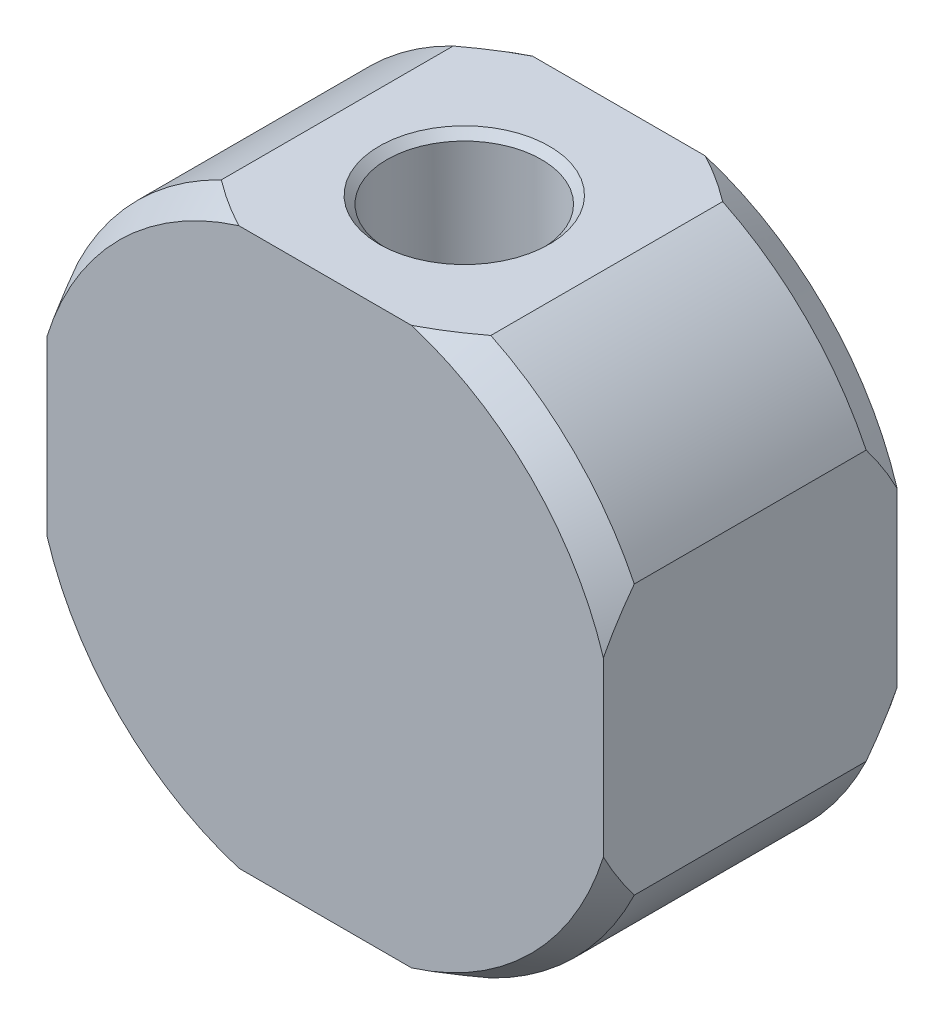
ISO-10303-21;
HEADER;
FILE_DESCRIPTION(('STEP AP214'),'2;1');
FILE_NAME('part.step','',(''),(''),'','','');
FILE_SCHEMA(('AUTOMOTIVE_DESIGN { 1 0 10303 214 1 1 1 1 }'));
ENDSEC;
DATA;
#1=APPLICATION_CONTEXT('core data for automotive mechanical design processes');
#2=APPLICATION_PROTOCOL_DEFINITION('international standard','automotive_design',2000,#1);
#3=PRODUCT_CONTEXT('',#1,'mechanical');
#4=PRODUCT('Part','Part','',(#3));
#5=PRODUCT_RELATED_PRODUCT_CATEGORY('part','',(#4));
#6=PRODUCT_DEFINITION_FORMATION('','',#4);
#7=PRODUCT_DEFINITION_CONTEXT('part definition',#1,'design');
#8=PRODUCT_DEFINITION('design','',#6,#7);
#9=PRODUCT_DEFINITION_SHAPE('','',#8);
#10=(LENGTH_UNIT() NAMED_UNIT(*) SI_UNIT(.MILLI.,.METRE.));
#11=(NAMED_UNIT(*) PLANE_ANGLE_UNIT() SI_UNIT($,.RADIAN.));
#12=(NAMED_UNIT(*) SI_UNIT($,.STERADIAN.) SOLID_ANGLE_UNIT());
#13=UNCERTAINTY_MEASURE_WITH_UNIT(LENGTH_MEASURE(1.E-05),#10,'distance_accuracy_value','');
#14=(GEOMETRIC_REPRESENTATION_CONTEXT(3) GLOBAL_UNCERTAINTY_ASSIGNED_CONTEXT((#13)) GLOBAL_UNIT_ASSIGNED_CONTEXT((#10,
#11,#12)) REPRESENTATION_CONTEXT('',''));
#15=CARTESIAN_POINT('',(0.,0.,0.));
#16=DIRECTION('',(0.,0.,1.));
#17=DIRECTION('',(1.,0.,0.));
#18=AXIS2_PLACEMENT_3D('',#15,#16,#17);
#19=CARTESIAN_POINT('',(0.,0.,8.5));
#20=DIRECTION('',(0.,0.,-1.));
#21=DIRECTION('',(-1.,0.,0.));
#22=AXIS2_PLACEMENT_3D('',#19,#20,#21);
#23=CYLINDRICAL_SURFACE('',#22,10.);
#24=CARTESIAN_POINT('',(0.,0.,1.));
#25=DIRECTION('',(0.,0.,1.));
#26=DIRECTION('',(1.,0.,0.));
#27=AXIS2_PLACEMENT_3D('',#24,#25,#26);
#28=CIRCLE('',#27,10.);
#29=CARTESIAN_POINT('',(-9.,-4.35889894377034,1.00000000017339));
#30=VERTEX_POINT('',#29);
#31=CARTESIAN_POINT('',(-4.35889894377034,-9.,1.00000000017339));
#32=VERTEX_POINT('',#31);
#33=EDGE_CURVE('E275',#30,#32,#28,.T.);
#34=ORIENTED_EDGE('',*,*,#33,.T.);
#35=DIRECTION('',(0.,0.,1.));
#36=VECTOR('',#35,1.);
#37=CARTESIAN_POINT('',(-4.358898944,-9.,4.75));
#38=LINE('',#37,#36);
#39=CARTESIAN_POINT('',(-4.35889894377034,-9.,8.49999999999995));
#40=VERTEX_POINT('',#39);
#41=EDGE_CURVE('E270',#32,#40,#38,.T.);
#42=ORIENTED_EDGE('',*,*,#41,.T.);
#43=CARTESIAN_POINT('',(0.,0.,8.49999999999995));
#44=DIRECTION('',(0.,0.,-1.));
#45=DIRECTION('',(-1.,0.,0.));
#46=AXIS2_PLACEMENT_3D('',#43,#44,#45);
#47=CIRCLE('',#46,10.);
#48=CARTESIAN_POINT('',(-9.,-4.35889894377034,8.49999999982658));
#49=VERTEX_POINT('',#48);
#50=EDGE_CURVE('E283',#40,#49,#47,.T.);
#51=ORIENTED_EDGE('',*,*,#50,.T.);
#52=DIRECTION('',(0.,0.,-1.));
#53=VECTOR('',#52,1.);
#54=CARTESIAN_POINT('',(-9.,-4.358898944,4.75));
#55=LINE('',#54,#53);
#56=EDGE_CURVE('E137',#49,#30,#55,.T.);
#57=ORIENTED_EDGE('',*,*,#56,.T.);
#58=EDGE_LOOP('',(#34,#42,#51,#57));
#59=FACE_BOUND('',#58,.T.);
#60=ADVANCED_FACE('F17',(#59),#23,.T.);
#61=CARTESIAN_POINT('',(0.,0.,8.5));
#62=DIRECTION('',(0.,0.,-1.));
#63=DIRECTION('',(-1.,0.,0.));
#64=AXIS2_PLACEMENT_3D('',#61,#62,#63);
#65=CYLINDRICAL_SURFACE('',#64,10.);
#66=CARTESIAN_POINT('',(0.,0.,1.));
#67=DIRECTION('',(0.,0.,1.));
#68=DIRECTION('',(1.,0.,0.));
#69=AXIS2_PLACEMENT_3D('',#66,#67,#68);
#70=CIRCLE('',#69,10.);
#71=CARTESIAN_POINT('',(4.35889894377034,-9.,1.00000000017339));
#72=VERTEX_POINT('',#71);
#73=CARTESIAN_POINT('',(9.,-4.35889894377034,1.00000000017339));
#74=VERTEX_POINT('',#73);
#75=EDGE_CURVE('E244',#72,#74,#70,.T.);
#76=ORIENTED_EDGE('',*,*,#75,.T.);
#77=DIRECTION('',(0.,0.,1.));
#78=VECTOR('',#77,1.);
#79=CARTESIAN_POINT('',(9.,-4.358898944,4.75));
#80=LINE('',#79,#78);
#81=CARTESIAN_POINT('',(9.,-4.35889894377034,8.49999999999995));
#82=VERTEX_POINT('',#81);
#83=EDGE_CURVE('E336',#74,#82,#80,.T.);
#84=ORIENTED_EDGE('',*,*,#83,.T.);
#85=CARTESIAN_POINT('',(0.,0.,8.49999999999995));
#86=DIRECTION('',(0.,0.,-1.));
#87=DIRECTION('',(-1.,0.,0.));
#88=AXIS2_PLACEMENT_3D('',#85,#86,#87);
#89=CIRCLE('',#88,10.);
#90=CARTESIAN_POINT('',(4.35889894377034,-9.,8.49999999982658));
#91=VERTEX_POINT('',#90);
#92=EDGE_CURVE('E140',#82,#91,#89,.T.);
#93=ORIENTED_EDGE('',*,*,#92,.T.);
#94=DIRECTION('',(0.,0.,-1.));
#95=VECTOR('',#94,1.);
#96=CARTESIAN_POINT('',(4.358898944,-9.,4.75));
#97=LINE('',#96,#95);
#98=EDGE_CURVE('E339',#91,#72,#97,.T.);
#99=ORIENTED_EDGE('',*,*,#98,.T.);
#100=EDGE_LOOP('',(#76,#84,#93,#99));
#101=FACE_BOUND('',#100,.T.);
#102=ADVANCED_FACE('F524',(#101),#65,.T.);
#103=CARTESIAN_POINT('',(0.,0.,9.5));
#104=DIRECTION('',(0.,0.,-1.));
#105=DIRECTION('',(-1.,0.,0.));
#106=AXIS2_PLACEMENT_3D('',#103,#104,#105);
#107=CONICAL_SURFACE('',#106,9.422649731,0.523598775456079);
#108=ORIENTED_EDGE('',*,*,#50,.F.);
#109=CARTESIAN_POINT('',(-4.35889894387178,-9.00000000004876,8.49999999977153));
#110=CARTESIAN_POINT('',(-4.23493665692643,-9.00000000001759,8.59356981136062));
#111=CARTESIAN_POINT('',(-4.10941613582162,-9.00000000000473,8.68512120420996));
#112=CARTESIAN_POINT('',(-3.85525157697568,-8.99999999999528,8.86325944023235));
#113=CARTESIAN_POINT('',(-3.72661373222858,-8.99999999999865,8.94985513500787));
#114=CARTESIAN_POINT('',(-3.46572204217459,-9.00000000000135,9.11752431060331));
#115=CARTESIAN_POINT('',(-3.33346738313278,-9.00000000000068,9.19859653415105));
#116=CARTESIAN_POINT('',(-3.06494049662724,-8.99999999999932,9.35437237156807));
#117=CARTESIAN_POINT('',(-2.92866128825377,-8.99999999999865,9.42906392405567));
#118=CARTESIAN_POINT('',(-2.79039924271421,-9.,9.50000000178068));
#119=B_SPLINE_CURVE_WITH_KNOTS('',3,(#109,#110,#111,#112,#113,#114,#115,#116,#117,#118),
.UNSPECIFIED.,.F.,.F.,(4,2,2,2,4),(0.,0.465956166670181,0.931052276461685,1.39625390180776,
1.8623162885717),.UNSPECIFIED.);
#120=CARTESIAN_POINT('',(-2.79039924444412,-9.,9.50000000089336));
#121=VERTEX_POINT('',#120);
#122=EDGE_CURVE('E153',#40,#121,#119,.T.);
#123=ORIENTED_EDGE('',*,*,#122,.T.);
#124=CARTESIAN_POINT('',(0.,0.,9.5));
#125=DIRECTION('',(0.,0.,-1.));
#126=DIRECTION('',(-1.,0.,0.));
#127=AXIS2_PLACEMENT_3D('',#124,#125,#126);
#128=CIRCLE('',#127,9.422649731);
#129=CARTESIAN_POINT('',(-9.,-2.79039924484618,9.50000000068713));
#130=VERTEX_POINT('',#129);
#131=EDGE_CURVE('E145',#130,#121,#128,.F.);
#132=ORIENTED_EDGE('',*,*,#131,.F.);
#133=CARTESIAN_POINT('',(-9.,-2.79039924350655,9.50000000137426));
#134=CARTESIAN_POINT('',(-9.,-2.92866128904794,9.42906392363047));
#135=CARTESIAN_POINT('',(-9.,-3.06494049742265,9.35437237112413));
#136=CARTESIAN_POINT('',(-9.,-3.33346738393047,9.1985965336708));
#137=CARTESIAN_POINT('',(-9.,-3.46572204297333,9.11752431010551));
#138=CARTESIAN_POINT('',(-9.,-3.7266137330304,8.94985513447704));
#139=CARTESIAN_POINT('',(-9.,-3.85525157777953,8.86325943968605));
#140=CARTESIAN_POINT('',(-9.,-4.10941613662623,8.68512120362897));
#141=CARTESIAN_POINT('',(-9.,-4.23493665772976,8.59356981076042));
#142=CARTESIAN_POINT('',(-9.,-4.35889894467011,8.49999999914729));
#143=B_SPLINE_CURVE_WITH_KNOTS('',3,(#133,#134,#135,#136,#137,#138,#139,#140,#141,#142),
.UNSPECIFIED.,.F.,.F.,(4,2,2,2,4),(0.,0.466062386794363,0.93126401217076,1.39636012199314,
1.86231628869423),.UNSPECIFIED.);
#144=EDGE_CURVE('E22',#130,#49,#143,.T.);
#145=ORIENTED_EDGE('',*,*,#144,.T.);
#146=EDGE_LOOP('',(#108,#123,#132,#145));
#147=FACE_BOUND('',#146,.T.);
#148=ADVANCED_FACE('F151',(#147),#107,.T.);
#149=CARTESIAN_POINT('',(0.,0.,9.5));
#150=DIRECTION('',(0.,0.,-1.));
#151=DIRECTION('',(-1.,0.,0.));
#152=AXIS2_PLACEMENT_3D('',#149,#150,#151);
#153=CONICAL_SURFACE('',#152,9.422649731,0.523598775456079);
#154=ORIENTED_EDGE('',*,*,#92,.F.);
#155=CARTESIAN_POINT('',(9.00000000016052,-4.35889894360155,8.50000000002485));
#156=CARTESIAN_POINT('',(9.00000000005792,-4.23493665664158,8.59356981158837));
#157=CARTESIAN_POINT('',(9.00000000001558,-4.1094161355308,8.68512120442392));
#158=CARTESIAN_POINT('',(8.99999999998445,-3.85525157668046,8.86325944042913));
#159=CARTESIAN_POINT('',(8.99999999999556,-3.72661373193489,8.94985513520121));
#160=CARTESIAN_POINT('',(9.00000000000445,-3.4657220418817,9.11752431078695));
#161=CARTESIAN_POINT('',(9.00000000000223,-3.33346738283912,9.1985965343284));
#162=CARTESIAN_POINT('',(8.99999999999777,-3.06494049633229,9.35437237173219));
#163=CARTESIAN_POINT('',(8.99999999999554,-2.92866128795828,9.42906392421287));
#164=CARTESIAN_POINT('',(9.,-2.79039924241919,9.500000001932));
#165=B_SPLINE_CURVE_WITH_KNOTS('',3,(#155,#156,#157,#158,#159,#160,#161,#162,#163,#164),
.UNSPECIFIED.,.F.,.F.,(4,2,2,2,4),(0.,0.465956166660282,0.931052276442495,1.39625390178048,
1.86231628853563),.UNSPECIFIED.);
#166=CARTESIAN_POINT('',(9.,-2.79039924429797,9.50000000096832));
#167=VERTEX_POINT('',#166);
#168=EDGE_CURVE('E243',#82,#167,#165,.T.);
#169=ORIENTED_EDGE('',*,*,#168,.T.);
#170=CARTESIAN_POINT('',(0.,0.,9.5));
#171=DIRECTION('',(0.,0.,-1.));
#172=DIRECTION('',(-1.,0.,0.));
#173=AXIS2_PLACEMENT_3D('',#170,#171,#172);
#174=CIRCLE('',#173,9.422649731);
#175=CARTESIAN_POINT('',(2.79039924427979,-9.,9.50000000097765));
#176=VERTEX_POINT('',#175);
#177=EDGE_CURVE('E157',#176,#167,#174,.F.);
#178=ORIENTED_EDGE('',*,*,#177,.F.);
#179=CARTESIAN_POINT('',(2.79039924234812,-8.99999999981732,9.50000000190531));
#180=CARTESIAN_POINT('',(2.92866128790724,-8.99999999993409,9.42906392421903));
#181=CARTESIAN_POINT('',(3.06494049628972,-8.99999999998227,9.35437237175065));
#182=CARTESIAN_POINT('',(3.33346738280364,-9.0000000000177,9.19859653435521));
#183=CARTESIAN_POINT('',(3.46572204184487,-9.00000000000506,9.11752431080989));
#184=CARTESIAN_POINT('',(3.72661373190026,-8.99999999999495,8.9498551352242));
#185=CARTESIAN_POINT('',(3.85525157664938,-8.99999999999747,8.86325944045604));
#186=CARTESIAN_POINT('',(4.10941613549633,-9.00000000000253,8.68512120444295));
#187=CARTESIAN_POINT('',(4.23493665660014,-9.00000000000508,8.59356981159554));
#188=CARTESIAN_POINT('',(4.35889894353948,-9.,8.5000000000009));
#189=B_SPLINE_CURVE_WITH_KNOTS('',3,(#179,#180,#181,#182,#183,#184,#185,#186,#187,#188),
.UNSPECIFIED.,.F.,.F.,(4,2,2,2,4),(0.,0.46606238676003,0.931264012100258,1.39636012188451,
1.8623162885491),.UNSPECIFIED.);
#190=EDGE_CURVE('E248',#176,#91,#189,.T.);
#191=ORIENTED_EDGE('',*,*,#190,.T.);
#192=EDGE_LOOP('',(#154,#169,#178,#191));
#193=FACE_BOUND('',#192,.T.);
#194=ADVANCED_FACE('F352',(#193),#153,.T.);
#195=CARTESIAN_POINT('',(-9.,-4.358898944,9.5));
#196=DIRECTION('',(1.,0.,0.));
#197=DIRECTION('',(0.,0.,-1.));
#198=AXIS2_PLACEMENT_3D('',#195,#196,#197);
#199=PLANE('',#198);
#200=CARTESIAN_POINT('',(-8.99999999988003,-2.79039924220841,-1.9986465601954E-09));
#201=CARTESIAN_POINT('',(-8.99999999995672,-2.92866128770988,0.0709360756684324));
#202=CARTESIAN_POINT('',(-8.99999999998836,-3.0649404960397,0.145627628108617));
#203=CARTESIAN_POINT('',(-9.00000000001162,-3.33346738245455,0.301403465437965));
#204=CARTESIAN_POINT('',(-9.00000000000332,-3.46572204144933,0.382475688945409));
#205=CARTESIAN_POINT('',(-8.99999999999668,-3.72661373141379,0.550144864453655));
#206=CARTESIAN_POINT('',(-8.99999999999834,-3.8552515761184,0.636740559182256));
#207=CARTESIAN_POINT('',(-9.00000000000167,-4.10941613487823,0.814878795113429));
#208=CARTESIAN_POINT('',(-9.00000000000333,-4.23493665593942,0.906430187918476));
#209=CARTESIAN_POINT('',(-9.,-4.35889894283749,0.999999999469108));
#210=B_SPLINE_CURVE_WITH_KNOTS('',3,(#200,#201,#202,#203,#204,#205,#206,#207,#208,#209),
.UNSPECIFIED.,.F.,.F.,(4,2,2,2,4),(0.,0.466062386580986,0.931264011743404,1.39636012135064,
1.86231628783706),.UNSPECIFIED.);
#211=CARTESIAN_POINT('',(-9.,-2.79039924420553,-1.01573803863351E-09));
#212=VERTEX_POINT('',#211);
#213=EDGE_CURVE('E271',#212,#30,#210,.T.);
#214=ORIENTED_EDGE('',*,*,#213,.T.);
#215=ORIENTED_EDGE('',*,*,#56,.F.);
#216=ORIENTED_EDGE('',*,*,#144,.F.);
#217=DIRECTION('',(0.,-1.,0.));
#218=VECTOR('',#217,1.);
#219=CARTESIAN_POINT('',(-9.,0.,9.5));
#220=LINE('',#219,#218);
#221=CARTESIAN_POINT('',(-9.,2.79039924504603,9.50000000058462));
#222=VERTEX_POINT('',#221);
#223=EDGE_CURVE('E134',#222,#130,#220,.T.);
#224=ORIENTED_EDGE('',*,*,#223,.F.);
#225=CARTESIAN_POINT('',(-9.,2.79039924390624,9.50000000116925));
#226=CARTESIAN_POINT('',(-9.,2.92866128940481,9.42906392343818));
#227=CARTESIAN_POINT('',(-9.,3.06494049773786,9.3543723709472));
#228=CARTESIAN_POINT('',(-9.,3.33346738416488,9.19859653352887));
#229=CARTESIAN_POINT('',(-9.,3.46572204316857,9.11752430998319));
#230=CARTESIAN_POINT('',(-9.,3.72661373314945,8.94985513439736));
#231=CARTESIAN_POINT('',(-9.,3.85525157786156,8.86325943962941));
#232=CARTESIAN_POINT('',(-9.,4.10941613663589,8.68512120362134));
#233=CARTESIAN_POINT('',(-9.,4.2349366577041,8.59356981077877));
#234=CARTESIAN_POINT('',(-9.,4.35889894460998,8.49999999919269));
#235=B_SPLINE_CURVE_WITH_KNOTS('',3,(#225,#226,#227,#228,#229,#230,#231,#232,#233,#234),
.UNSPECIFIED.,.F.,.F.,(4,2,2,2,4),(0.,0.466062386662784,0.931264011908425,1.39636012160017,
1.86231628816982),.UNSPECIFIED.);
#236=CARTESIAN_POINT('',(-8.99999999955596,4.35889894499214,8.49999999959635));
#237=VERTEX_POINT('',#236);
#238=EDGE_CURVE('E313',#222,#237,#235,.T.);
#239=ORIENTED_EDGE('',*,*,#238,.T.);
#240=DIRECTION('',(0.,0.,1.));
#241=VECTOR('',#240,1.);
#242=CARTESIAN_POINT('',(-8.99999999911193,4.35889894537431,4.75));
#243=LINE('',#242,#241);
#244=CARTESIAN_POINT('',(-8.99999999955596,4.35889894440427,0.999999999959817));
#245=VERTEX_POINT('',#244);
#246=EDGE_CURVE('E343',#237,#245,#243,.F.);
#247=ORIENTED_EDGE('',*,*,#246,.T.);
#248=CARTESIAN_POINT('',(-9.00000000007316,4.35889894344974,0.999999999899076));
#249=CARTESIAN_POINT('',(-9.0000000000264,4.23493665653581,0.906430188347985));
#250=CARTESIAN_POINT('',(-9.0000000000071,4.10941613546512,0.814878795533167));
#251=CARTESIAN_POINT('',(-8.99999999999291,3.85525157669076,0.636740559574977));
#252=CARTESIAN_POINT('',(-8.99999999999797,3.72661373198109,0.550144864829158));
#253=CARTESIAN_POINT('',(-9.00000000000203,3.46572204200362,0.38247568929073));
#254=CARTESIAN_POINT('',(-9.00000000000102,3.33346738300088,0.301403465770318));
#255=CARTESIAN_POINT('',(-8.99999999999898,3.064940496576,0.145627628404314));
#256=CARTESIAN_POINT('',(-8.99999999999797,2.92866128824413,0.0709360759403989));
#257=CARTESIAN_POINT('',(-9.,2.79039924274761,-1.76354038541045E-09));
#258=B_SPLINE_CURVE_WITH_KNOTS('',3,(#248,#249,#250,#251,#252,#253,#254,#255,#256,#257),
.UNSPECIFIED.,.F.,.F.,(4,2,2,2,4),(0.,0.46595616652655,0.931052276175267,1.39625390137869,
1.86231628799913),.UNSPECIFIED.);
#259=CARTESIAN_POINT('',(-9.,2.79039924446146,-8.84466688641604E-10));
#260=VERTEX_POINT('',#259);
#261=EDGE_CURVE('E304',#245,#260,#258,.T.);
#262=ORIENTED_EDGE('',*,*,#261,.T.);
#263=DIRECTION('',(0.,-1.,0.));
#264=VECTOR('',#263,1.);
#265=CARTESIAN_POINT('',(-9.,0.,0.));
#266=LINE('',#265,#264);
#267=EDGE_CURVE('E380',#260,#212,#266,.T.);
#268=ORIENTED_EDGE('',*,*,#267,.T.);
#269=EDGE_LOOP('',(#214,#215,#216,#224,#239,#247,#262,#268));
#270=FACE_BOUND('',#269,.T.);
#271=ADVANCED_FACE('F133',(#270),#199,.F.);
#272=CARTESIAN_POINT('',(0.,0.,0.));
#273=DIRECTION('',(0.,0.,1.));
#274=DIRECTION('',(1.,0.,0.));
#275=AXIS2_PLACEMENT_3D('',#272,#273,#274);
#276=CONICAL_SURFACE('',#275,9.422649731,0.523598775456078);
#277=CARTESIAN_POINT('',(0.,0.,0.));
#278=DIRECTION('',(0.,0.,1.));
#279=DIRECTION('',(1.,0.,0.));
#280=AXIS2_PLACEMENT_3D('',#277,#278,#279);
#281=CIRCLE('',#280,9.422649731);
#282=CARTESIAN_POINT('',(-2.79039924427979,-9.,-9.77651099944528E-10));
#283=VERTEX_POINT('',#282);
#284=EDGE_CURVE('E379',#212,#283,#281,.T.);
#285=ORIENTED_EDGE('',*,*,#284,.T.);
#286=CARTESIAN_POINT('',(-2.79039924234812,-8.99999999981732,-1.90531114763613E-09));
#287=CARTESIAN_POINT('',(-2.92866128790724,-8.99999999993409,0.0709360757809675));
#288=CARTESIAN_POINT('',(-3.06494049628971,-8.99999999998227,0.145627628249345));
#289=CARTESIAN_POINT('',(-3.33346738280363,-9.0000000000177,0.301403465644791));
#290=CARTESIAN_POINT('',(-3.46572204184486,-9.00000000000506,0.382475689190107));
#291=CARTESIAN_POINT('',(-3.72661373190026,-8.99999999999495,0.550144864775799));
#292=CARTESIAN_POINT('',(-3.85525157664937,-8.99999999999747,0.636740559543963));
#293=CARTESIAN_POINT('',(-4.10941613549633,-9.00000000000253,0.814878795557047));
#294=CARTESIAN_POINT('',(-4.23493665660013,-9.00000000000508,0.906430188404455));
#295=CARTESIAN_POINT('',(-4.35889894353947,-9.,0.999999999999097));
#296=B_SPLINE_CURVE_WITH_KNOTS('',3,(#286,#287,#288,#289,#290,#291,#292,#293,#294,#295),
.UNSPECIFIED.,.F.,.F.,(4,2,2,2,4),(0.,0.466062386760028,0.931264012100254,1.3963601218845,
1.8623162885491),.UNSPECIFIED.);
#297=EDGE_CURVE('E265',#283,#32,#296,.T.);
#298=ORIENTED_EDGE('',*,*,#297,.T.);
#299=ORIENTED_EDGE('',*,*,#33,.F.);
#300=ORIENTED_EDGE('',*,*,#213,.F.);
#301=EDGE_LOOP('',(#285,#298,#299,#300));
#302=FACE_BOUND('',#301,.T.);
#303=ADVANCED_FACE('F227',(#302),#276,.T.);
#304=CARTESIAN_POINT('',(-4.358898944,-9.,0.));
#305=DIRECTION('',(0.,1.,0.));
#306=DIRECTION('',(0.,0.,1.));
#307=AXIS2_PLACEMENT_3D('',#304,#305,#306);
#308=PLANE('',#307);
#309=CARTESIAN_POINT('',(2.79039924277692,-8.99999999976557,-1.66747882144046E-09));
#310=CARTESIAN_POINT('',(2.92866128828877,-8.99999999991542,0.0709360759932127));
#311=CARTESIAN_POINT('',(3.06494049662254,-8.99999999997725,0.145627628438065));
#312=CARTESIAN_POINT('',(3.33346738303943,-9.00000000002271,0.301403465785947));
#313=CARTESIAN_POINT('',(3.46572204203233,-9.00000000000649,0.38247568930723));
#314=CARTESIAN_POINT('',(3.72661373199415,-8.99999999999351,0.550144864839491));
#315=CARTESIAN_POINT('',(3.85525157669803,-8.99999999999675,0.636740559578253));
#316=CARTESIAN_POINT('',(4.10941613545667,-9.00000000000325,0.814878795529068));
#317=CARTESIAN_POINT('',(4.2349366565174,-9.00000000000651,0.9064301883436));
#318=CARTESIAN_POINT('',(4.35889894341441,-9.,0.999999999904671));
#319=B_SPLINE_CURVE_WITH_KNOTS('',3,(#309,#310,#311,#312,#313,#314,#315,#316,#317,#318),
.UNSPECIFIED.,.F.,.F.,(4,2,2,2,4),(0.,0.466062386598184,0.931264011777149,1.39636012139975,
1.86231628790205),.UNSPECIFIED.);
#320=CARTESIAN_POINT('',(2.79039924449782,-9.,-8.65815844798555E-10));
#321=VERTEX_POINT('',#320);
#322=EDGE_CURVE('E237',#321,#72,#319,.T.);
#323=ORIENTED_EDGE('',*,*,#322,.T.);
#324=ORIENTED_EDGE('',*,*,#98,.F.);
#325=ORIENTED_EDGE('',*,*,#190,.F.);
#326=DIRECTION('',(1.,0.,0.));
#327=VECTOR('',#326,1.);
#328=CARTESIAN_POINT('',(0.,-9.,9.5));
#329=LINE('',#328,#327);
#330=EDGE_CURVE('E155',#121,#176,#329,.T.);
#331=ORIENTED_EDGE('',*,*,#330,.F.);
#332=ORIENTED_EDGE('',*,*,#122,.F.);
#333=ORIENTED_EDGE('',*,*,#41,.F.);
#334=ORIENTED_EDGE('',*,*,#297,.F.);
#335=DIRECTION('',(1.,0.,0.));
#336=VECTOR('',#335,1.);
#337=CARTESIAN_POINT('',(0.,-9.,0.));
#338=LINE('',#337,#336);
#339=EDGE_CURVE('E376',#283,#321,#338,.T.);
#340=ORIENTED_EDGE('',*,*,#339,.T.);
#341=EDGE_LOOP('',(#323,#324,#325,#331,#332,#333,#334,#340));
#342=FACE_BOUND('',#341,.T.);
#343=ADVANCED_FACE('F225',(#342),#308,.F.);
#344=CARTESIAN_POINT('',(0.,0.,0.));
#345=DIRECTION('',(0.,0.,1.));
#346=DIRECTION('',(1.,0.,0.));
#347=AXIS2_PLACEMENT_3D('',#344,#345,#346);
#348=CONICAL_SURFACE('',#347,9.422649731,0.523598775456078);
#349=CARTESIAN_POINT('',(0.,0.,0.));
#350=DIRECTION('',(0.,0.,1.));
#351=DIRECTION('',(1.,0.,0.));
#352=AXIS2_PLACEMENT_3D('',#349,#350,#351);
#353=CIRCLE('',#352,9.422649731);
#354=CARTESIAN_POINT('',(9.,-2.79039924484618,-6.87132972588794E-10));
#355=VERTEX_POINT('',#354);
#356=EDGE_CURVE('E375',#321,#355,#353,.T.);
#357=ORIENTED_EDGE('',*,*,#356,.T.);
#358=CARTESIAN_POINT('',(9.,-2.79039924350655,-1.37426417910618E-09));
#359=CARTESIAN_POINT('',(9.,-2.92866128904794,0.0709360763695279));
#360=CARTESIAN_POINT('',(9.,-3.06494049742264,0.14562762887587));
#361=CARTESIAN_POINT('',(9.,-3.33346738393046,0.301403466329198));
#362=CARTESIAN_POINT('',(9.,-3.46572204297333,0.382475689894493));
#363=CARTESIAN_POINT('',(9.,-3.72661373303039,0.550144865522965));
#364=CARTESIAN_POINT('',(9.,-3.85525157777953,0.636740560313954));
#365=CARTESIAN_POINT('',(9.,-4.10941613662622,0.814878796371027));
#366=CARTESIAN_POINT('',(9.,-4.23493665772976,0.906430189239579));
#367=CARTESIAN_POINT('',(9.,-4.35889894467011,1.00000000085271));
#368=B_SPLINE_CURVE_WITH_KNOTS('',3,(#358,#359,#360,#361,#362,#363,#364,#365,#366,#367),
.UNSPECIFIED.,.F.,.F.,(4,2,2,2,4),(0.,0.466062386794361,0.931264012170756,1.39636012199313,
1.86231628869422),.UNSPECIFIED.);
#369=EDGE_CURVE('E231',#355,#74,#368,.T.);
#370=ORIENTED_EDGE('',*,*,#369,.T.);
#371=ORIENTED_EDGE('',*,*,#75,.F.);
#372=ORIENTED_EDGE('',*,*,#322,.F.);
#373=EDGE_LOOP('',(#357,#370,#371,#372));
#374=FACE_BOUND('',#373,.T.);
#375=ADVANCED_FACE('F220',(#374),#348,.T.);
#376=CARTESIAN_POINT('',(9.,-4.358898944,0.));
#377=DIRECTION('',(-1.,0.,0.));
#378=DIRECTION('',(0.,0.,1.));
#379=AXIS2_PLACEMENT_3D('',#376,#377,#378);
#380=PLANE('',#379);
#381=ORIENTED_EDGE('',*,*,#369,.F.);
#382=DIRECTION('',(0.,1.,0.));
#383=VECTOR('',#382,1.);
#384=CARTESIAN_POINT('',(9.,0.,0.));
#385=LINE('',#384,#383);
#386=CARTESIAN_POINT('',(9.,2.79039924504604,-5.84624047643861E-10));
#387=VERTEX_POINT('',#386);
#388=EDGE_CURVE('E372',#355,#387,#385,.T.);
#389=ORIENTED_EDGE('',*,*,#388,.T.);
#390=CARTESIAN_POINT('',(9.,2.79039924390625,-1.16924701904875E-09));
#391=CARTESIAN_POINT('',(9.,2.92866128929556,0.0709360765057286));
#392=CARTESIAN_POINT('',(9.,3.06494049752253,0.145627628934747));
#393=CARTESIAN_POINT('',(9.,3.3334673837437,0.301403466219919));
#394=CARTESIAN_POINT('',(9.,3.46572204264762,0.38247568969443));
#395=CARTESIAN_POINT('',(9.,3.72661373243434,0.550144865130629));
#396=CARTESIAN_POINT('',(9.,3.85525157705208,0.636740559820135));
#397=CARTESIAN_POINT('',(9.,4.1094161356419,0.814878795665139));
#398=CARTESIAN_POINT('',(9.,4.23493665661999,0.906430188423072));
#399=CARTESIAN_POINT('',(9.,4.35889894343781,0.999999999922341));
#400=B_SPLINE_CURVE_WITH_KNOTS('',3,(#390,#391,#392,#393,#394,#395,#396,#397,#398,#399),
.UNSPECIFIED.,.F.,.F.,(4,2,2,2,4),(0.,0.466062386294673,0.931264011173912,1.39636012049956,
1.86231628670139),.UNSPECIFIED.);
#401=CARTESIAN_POINT('',(9.00000000044999,4.35889894255834,0.999999999959817));
#402=VERTEX_POINT('',#401);
#403=EDGE_CURVE('E170',#387,#402,#400,.T.);
#404=ORIENTED_EDGE('',*,*,#403,.T.);
#405=DIRECTION('',(0.,0.,-1.));
#406=VECTOR('',#405,1.);
#407=CARTESIAN_POINT('',(9.00000000089998,4.35889894168245,4.75));
#408=LINE('',#407,#406);
#409=CARTESIAN_POINT('',(9.00000000044999,4.3588989422644,8.50000000026208));
#410=VERTEX_POINT('',#409);
#411=EDGE_CURVE('E330',#402,#410,#408,.F.);
#412=ORIENTED_EDGE('',*,*,#411,.T.);
#413=CARTESIAN_POINT('',(9.00000000029666,4.35889894290929,8.50000000060756));
#414=CARTESIAN_POINT('',(9.00000000010704,4.23493665601032,8.59356981207416));
#415=CARTESIAN_POINT('',(9.0000000000288,4.10941613497303,8.68512120482947));
#416=CARTESIAN_POINT('',(8.99999999997126,3.8552515762827,8.86325944069329));
#417=CARTESIAN_POINT('',(8.99999999999179,3.72661373162362,8.94985513540418));
#418=CARTESIAN_POINT('',(9.00000000000822,3.4657220417455,9.11752431087157));
#419=CARTESIAN_POINT('',(9.00000000000411,3.33346738279151,9.19859653435583));
#420=CARTESIAN_POINT('',(8.99999999999588,3.06494049646773,9.35437237165381));
#421=CARTESIAN_POINT('',(8.99999999999175,2.92866128818824,9.42906392408588));
#422=CARTESIAN_POINT('',(9.,2.79039924274761,9.50000000176355));
#423=B_SPLINE_CURVE_WITH_KNOTS('',3,(#413,#414,#415,#416,#417,#418,#419,#420,#421,#422),
.UNSPECIFIED.,.F.,.F.,(4,2,2,2,4),(0.,0.465956166340565,0.931052275805591,1.39625390082757,
1.86231628726405),.UNSPECIFIED.);
#424=CARTESIAN_POINT('',(9.,2.79039924446146,9.50000000088447));
#425=VERTEX_POINT('',#424);
#426=EDGE_CURVE('E149',#410,#425,#423,.T.);
#427=ORIENTED_EDGE('',*,*,#426,.T.);
#428=DIRECTION('',(0.,1.,0.));
#429=VECTOR('',#428,1.);
#430=CARTESIAN_POINT('',(9.,0.,9.5));
#431=LINE('',#430,#429);
#432=EDGE_CURVE('E320',#167,#425,#431,.T.);
#433=ORIENTED_EDGE('',*,*,#432,.F.);
#434=ORIENTED_EDGE('',*,*,#168,.F.);
#435=ORIENTED_EDGE('',*,*,#83,.F.);
#436=EDGE_LOOP('',(#381,#389,#404,#412,#427,#433,#434,#435));
#437=FACE_BOUND('',#436,.T.);
#438=ADVANCED_FACE('F176',(#437),#380,.F.);
#439=CARTESIAN_POINT('',(2.53,4.,2.47));
#440=DIRECTION('',(0.,1.,0.));
#441=DIRECTION('',(-1.,0.,0.));
#442=AXIS2_PLACEMENT_3D('',#439,#440,#441);
#443=PLANE('',#442);
#444=CARTESIAN_POINT('',(0.,4.,5.));
#445=DIRECTION('',(0.,1.,0.));
#446=DIRECTION('',(0.,0.,1.));
#447=AXIS2_PLACEMENT_3D('',#444,#445,#446);
#448=CIRCLE('',#447,2.5);
#449=CARTESIAN_POINT('',(0.,4.,7.5));
#450=VERTEX_POINT('',#449);
#451=EDGE_CURVE('E212',#450,#450,#448,.F.);
#452=ORIENTED_EDGE('',*,*,#451,.F.);
#453=EDGE_LOOP('',(#452));
#454=FACE_BOUND('',#453,.T.);
#455=ADVANCED_FACE('F218',(#454),#443,.T.);
#456=CARTESIAN_POINT('',(0.,0.,0.));
#457=DIRECTION('',(0.,0.,1.));
#458=DIRECTION('',(1.,0.,0.));
#459=AXIS2_PLACEMENT_3D('',#456,#457,#458);
#460=CONICAL_SURFACE('',#459,9.422649731,0.523598775456078);
#461=CARTESIAN_POINT('',(0.,0.,0.));
#462=DIRECTION('',(0.,0.,1.));
#463=DIRECTION('',(1.,0.,0.));
#464=AXIS2_PLACEMENT_3D('',#461,#462,#463);
#465=CIRCLE('',#464,9.422649731);
#466=CARTESIAN_POINT('',(2.79039924478983,9.,-7.16035604598564E-10));
#467=VERTEX_POINT('',#466);
#468=EDGE_CURVE('E310',#387,#467,#465,.T.);
#469=ORIENTED_EDGE('',*,*,#468,.T.);
#470=CARTESIAN_POINT('',(2.79039924336204,8.9999999997734,-1.37006113766803E-09));
#471=CARTESIAN_POINT('',(2.9286612889392,8.99999999991824,0.070936076339443));
#472=CARTESIAN_POINT('',(3.0649404973367,8.99999999997801,0.14562762883533));
#473=CARTESIAN_POINT('',(3.33346738387764,9.00000000002195,0.301403466289253));
#474=CARTESIAN_POINT('',(3.46572204293086,9.00000000000627,0.382475689865531));
#475=CARTESIAN_POINT('',(3.72661373301003,8.99999999999373,0.550144865511541));
#476=CARTESIAN_POINT('',(3.85525157777095,8.99999999999686,0.636740560309055));
#477=CARTESIAN_POINT('',(4.10941613664111,9.00000000000315,0.814878796380343));
#478=CARTESIAN_POINT('',(4.23493665775632,9.0000000000063,0.906430189256602));
#479=CARTESIAN_POINT('',(4.35889894470667,9.,1.00000000088031));
#480=B_SPLINE_CURVE_WITH_KNOTS('',3,(#470,#471,#472,#473,#474,#475,#476,#477,#478,#479),
.UNSPECIFIED.,.F.,.F.,(4,2,2,2,4),(0.,0.466062386839287,0.931264012258602,1.39636012212147,
1.86231628886481),.UNSPECIFIED.);
#481=CARTESIAN_POINT('',(4.35889894377034,9.,1.00000000017339));
#482=VERTEX_POINT('',#481);
#483=EDGE_CURVE('E206',#467,#482,#480,.T.);
#484=ORIENTED_EDGE('',*,*,#483,.T.);
#485=CARTESIAN_POINT('',(0.,0.,0.999999999999999));
#486=DIRECTION('',(0.,0.,-1.));
#487=DIRECTION('',(-1.,0.,0.));
#488=AXIS2_PLACEMENT_3D('',#485,#486,#487);
#489=CIRCLE('',#488,10.);
#490=EDGE_CURVE('E331',#482,#402,#489,.T.);
#491=ORIENTED_EDGE('',*,*,#490,.T.);
#492=ORIENTED_EDGE('',*,*,#403,.F.);
#493=EDGE_LOOP('',(#469,#484,#491,#492));
#494=FACE_BOUND('',#493,.T.);
#495=ADVANCED_FACE('F214',(#494),#460,.T.);
#496=CARTESIAN_POINT('',(0.,0.,8.5));
#497=DIRECTION('',(0.,0.,-1.));
#498=DIRECTION('',(-1.,0.,0.));
#499=AXIS2_PLACEMENT_3D('',#496,#497,#498);
#500=CYLINDRICAL_SURFACE('',#499,10.);
#501=ORIENTED_EDGE('',*,*,#490,.F.);
#502=DIRECTION('',(0.,0.,1.));
#503=VECTOR('',#502,1.);
#504=CARTESIAN_POINT('',(4.358898944,9.,4.75));
#505=LINE('',#504,#503);
#506=CARTESIAN_POINT('',(4.35889894412368,9.,8.49999999955982));
#507=VERTEX_POINT('',#506);
#508=EDGE_CURVE('E200',#482,#507,#505,.T.);
#509=ORIENTED_EDGE('',*,*,#508,.T.);
#510=CARTESIAN_POINT('',(0.,0.,8.49999999999995));
#511=DIRECTION('',(0.,0.,-1.));
#512=DIRECTION('',(-1.,0.,0.));
#513=AXIS2_PLACEMENT_3D('',#510,#511,#512);
#514=CIRCLE('',#513,10.);
#515=EDGE_CURVE('E169',#507,#410,#514,.T.);
#516=ORIENTED_EDGE('',*,*,#515,.T.);
#517=ORIENTED_EDGE('',*,*,#411,.F.);
#518=EDGE_LOOP('',(#501,#509,#516,#517));
#519=FACE_BOUND('',#518,.T.);
#520=ADVANCED_FACE('F185',(#519),#500,.T.);
#521=CARTESIAN_POINT('',(0.,0.,9.5));
#522=DIRECTION('',(0.,0.,-1.));
#523=DIRECTION('',(-1.,0.,0.));
#524=AXIS2_PLACEMENT_3D('',#521,#522,#523);
#525=CONICAL_SURFACE('',#524,9.422649731,0.523598775456079);
#526=ORIENTED_EDGE('',*,*,#515,.F.);
#527=CARTESIAN_POINT('',(4.35889894470668,9.,8.49999999911968));
#528=CARTESIAN_POINT('',(4.23493665779894,9.,8.59356981070884));
#529=CARTESIAN_POINT('',(4.10941613672885,9.,8.68512120355449));
#530=CARTESIAN_POINT('',(3.85525157795065,9.,8.86325943956867));
#531=CARTESIAN_POINT('',(3.72661373323656,9.,8.94985513433967));
#532=CARTESIAN_POINT('',(3.46572204325163,9.,9.11752430993152));
#533=CARTESIAN_POINT('',(3.33346738424585,9.,9.19859653348019));
#534=CARTESIAN_POINT('',(3.06494049781455,9.,9.35437237090442));
#535=CARTESIAN_POINT('',(2.92866128947928,9.,9.4290639233983));
#536=CARTESIAN_POINT('',(2.79039924397842,9.,9.50000000113223));
#537=B_SPLINE_CURVE_WITH_KNOTS('',3,(#527,#528,#529,#530,#531,#532,#533,#534,#535,#536),
.UNSPECIFIED.,.F.,.F.,(4,2,2,2,4),(0.,0.465956166579658,0.931052276281413,1.39625390153706,
1.86231628820987),.UNSPECIFIED.);
#538=CARTESIAN_POINT('',(2.79039924618576,9.,9.50000000000003));
#539=VERTEX_POINT('',#538);
#540=EDGE_CURVE('E192',#507,#539,#537,.T.);
#541=ORIENTED_EDGE('',*,*,#540,.T.);
#542=CARTESIAN_POINT('',(0.,0.,9.50000000000006));
#543=DIRECTION('',(0.,0.,-1.));
#544=DIRECTION('',(-1.,0.,0.));
#545=AXIS2_PLACEMENT_3D('',#542,#543,#544);
#546=CIRCLE('',#545,9.42264973099997);
#547=EDGE_CURVE('E319',#425,#539,#546,.F.);
#548=ORIENTED_EDGE('',*,*,#547,.F.);
#549=ORIENTED_EDGE('',*,*,#426,.F.);
#550=EDGE_LOOP('',(#526,#541,#548,#549));
#551=FACE_BOUND('',#550,.T.);
#552=ADVANCED_FACE('F180',(#551),#525,.T.);
#553=CARTESIAN_POINT('',(-9.,-9.,9.5));
#554=DIRECTION('',(0.,0.,1.));
#555=DIRECTION('',(1.,0.,0.));
#556=AXIS2_PLACEMENT_3D('',#553,#554,#555);
#557=PLANE('',#556);
#558=ORIENTED_EDGE('',*,*,#432,.T.);
#559=ORIENTED_EDGE('',*,*,#547,.T.);
#560=DIRECTION('',(-1.,0.,0.));
#561=VECTOR('',#560,1.);
#562=CARTESIAN_POINT('',(0.,9.,9.5));
#563=LINE('',#562,#561);
#564=CARTESIAN_POINT('',(-2.79039924478977,9.,9.50000000071607));
#565=VERTEX_POINT('',#564);
#566=EDGE_CURVE('E199',#539,#565,#563,.T.);
#567=ORIENTED_EDGE('',*,*,#566,.T.);
#568=CARTESIAN_POINT('',(0.,0.,9.50000000000006));
#569=DIRECTION('',(0.,0.,-1.));
#570=DIRECTION('',(-1.,0.,0.));
#571=AXIS2_PLACEMENT_3D('',#568,#569,#570);
#572=CIRCLE('',#571,9.42264973099997);
#573=EDGE_CURVE('E148',#565,#222,#572,.F.);
#574=ORIENTED_EDGE('',*,*,#573,.T.);
#575=ORIENTED_EDGE('',*,*,#223,.T.);
#576=ORIENTED_EDGE('',*,*,#131,.T.);
#577=ORIENTED_EDGE('',*,*,#330,.T.);
#578=ORIENTED_EDGE('',*,*,#177,.T.);
#579=EDGE_LOOP('',(#558,#559,#567,#574,#575,#576,#577,#578));
#580=FACE_BOUND('',#579,.T.);
#581=ADVANCED_FACE('F143',(#580),#557,.T.);
#582=CARTESIAN_POINT('',(0.,0.,9.5));
#583=DIRECTION('',(0.,0.,-1.));
#584=DIRECTION('',(-1.,0.,0.));
#585=AXIS2_PLACEMENT_3D('',#582,#583,#584);
#586=CONICAL_SURFACE('',#585,9.422649731,0.523598775456079);
#587=CARTESIAN_POINT('',(0.,0.,8.5));
#588=DIRECTION('',(0.,0.,-1.));
#589=DIRECTION('',(-1.,0.,0.));
#590=AXIS2_PLACEMENT_3D('',#587,#588,#589);
#591=CIRCLE('',#590,10.);
#592=CARTESIAN_POINT('',(-4.35889894377034,9.,8.49999999982661));
#593=VERTEX_POINT('',#592);
#594=EDGE_CURVE('E318',#593,#237,#591,.F.);
#595=ORIENTED_EDGE('',*,*,#594,.T.);
#596=ORIENTED_EDGE('',*,*,#238,.F.);
#597=ORIENTED_EDGE('',*,*,#573,.F.);
#598=CARTESIAN_POINT('',(-2.79039924336203,8.99999999977339,9.50000000137006));
#599=CARTESIAN_POINT('',(-2.92866128888417,8.99999999991824,9.42906392368881));
#600=CARTESIAN_POINT('',(-3.06494049722826,8.99999999997801,9.35437237122412));
#601=CARTESIAN_POINT('',(-3.33346738366554,9.00000000002195,9.19859653383726));
#602=CARTESIAN_POINT('',(-3.46572204266851,9.00000000000627,9.11752431029682));
#603=CARTESIAN_POINT('',(-3.72661373264992,8.99999999999373,8.94985513472615));
#604=CARTESIAN_POINT('',(-3.85525157736331,8.99999999999686,8.86325943996814));
#605=CARTESIAN_POINT('',(-4.10941613614056,9.00000000000315,8.68512120397897));
#606=CARTESIAN_POINT('',(-4.23493665721038,9.0000000000063,8.59356981114534));
#607=CARTESIAN_POINT('',(-4.35889894411639,9.,8.49999999956534));
#608=B_SPLINE_CURVE_WITH_KNOTS('',3,(#598,#599,#600,#601,#602,#603,#604,#605,#606,#607),
.UNSPECIFIED.,.F.,.F.,(4,2,2,2,4),(0.,0.466062386653917,0.931264011888723,1.39636012156723,
1.86231628812535),.UNSPECIFIED.);
#609=EDGE_CURVE('E201',#565,#593,#608,.T.);
#610=ORIENTED_EDGE('',*,*,#609,.T.);
#611=EDGE_LOOP('',(#595,#596,#597,#610));
#612=FACE_BOUND('',#611,.T.);
#613=ADVANCED_FACE('F187',(#612),#586,.T.);
#614=CARTESIAN_POINT('',(0.,0.,8.5));
#615=DIRECTION('',(0.,0.,-1.));
#616=DIRECTION('',(-1.,0.,0.));
#617=AXIS2_PLACEMENT_3D('',#614,#615,#616);
#618=CYLINDRICAL_SURFACE('',#617,10.);
#619=CARTESIAN_POINT('',(0.,0.,1.));
#620=DIRECTION('',(0.,0.,1.));
#621=DIRECTION('',(1.,0.,0.));
#622=AXIS2_PLACEMENT_3D('',#619,#620,#621);
#623=CIRCLE('',#622,10.);
#624=CARTESIAN_POINT('',(-4.35889894412367,9.,1.00000000044016));
#625=VERTEX_POINT('',#624);
#626=EDGE_CURVE('E311',#625,#245,#623,.T.);
#627=ORIENTED_EDGE('',*,*,#626,.T.);
#628=ORIENTED_EDGE('',*,*,#246,.F.);
#629=ORIENTED_EDGE('',*,*,#594,.F.);
#630=DIRECTION('',(0.,0.,-1.));
#631=VECTOR('',#630,1.);
#632=CARTESIAN_POINT('',(-4.358898944,9.,4.75));
#633=LINE('',#632,#631);
#634=EDGE_CURVE('E292',#593,#625,#633,.T.);
#635=ORIENTED_EDGE('',*,*,#634,.T.);
#636=EDGE_LOOP('',(#627,#628,#629,#635));
#637=FACE_BOUND('',#636,.T.);
#638=ADVANCED_FACE('F298',(#637),#618,.T.);
#639=CARTESIAN_POINT('',(0.,0.,0.));
#640=DIRECTION('',(0.,0.,1.));
#641=DIRECTION('',(1.,0.,0.));
#642=AXIS2_PLACEMENT_3D('',#639,#640,#641);
#643=CONICAL_SURFACE('',#642,9.422649731,0.523598775456078);
#644=CARTESIAN_POINT('',(0.,0.,0.));
#645=DIRECTION('',(0.,0.,1.));
#646=DIRECTION('',(1.,0.,0.));
#647=AXIS2_PLACEMENT_3D('',#644,#645,#646);
#648=CIRCLE('',#647,9.422649731);
#649=CARTESIAN_POINT('',(-2.79039924618582,9.,0.));
#650=VERTEX_POINT('',#649);
#651=EDGE_CURVE('E42',#650,#260,#648,.T.);
#652=ORIENTED_EDGE('',*,*,#651,.T.);
#653=ORIENTED_EDGE('',*,*,#261,.F.);
#654=ORIENTED_EDGE('',*,*,#626,.F.);
#655=CARTESIAN_POINT('',(-4.35889894470667,9.,1.00000000088031));
#656=CARTESIAN_POINT('',(-4.23493665779894,9.,0.906430189291153));
#657=CARTESIAN_POINT('',(-4.10941613672884,9.,0.814878796445507));
#658=CARTESIAN_POINT('',(-3.85525157795065,9.,0.636740560431325));
#659=CARTESIAN_POINT('',(-3.72661373323656,9.,0.550144865660331));
#660=CARTESIAN_POINT('',(-3.46572204325163,9.,0.382475690068481));
#661=CARTESIAN_POINT('',(-3.33346738424585,9.,0.301403466519809));
#662=CARTESIAN_POINT('',(-3.06494049781455,9.,0.145627629095581));
#663=CARTESIAN_POINT('',(-2.92866128947928,9.,0.0709360766016993));
#664=CARTESIAN_POINT('',(-2.79039924397842,9.,-1.13222844968191E-09));
#665=B_SPLINE_CURVE_WITH_KNOTS('',3,(#655,#656,#657,#658,#659,#660,#661,#662,#663,#664),
.UNSPECIFIED.,.F.,.F.,(4,2,2,2,4),(0.,0.465956166579655,0.931052276281406,1.39625390153705,
1.86231628820985),.UNSPECIFIED.);
#666=EDGE_CURVE('E285',#625,#650,#665,.T.);
#667=ORIENTED_EDGE('',*,*,#666,.T.);
#668=EDGE_LOOP('',(#652,#653,#654,#667));
#669=FACE_BOUND('',#668,.T.);
#670=ADVANCED_FACE('F293',(#669),#643,.T.);
#671=CARTESIAN_POINT('',(-9.,-9.,0.));
#672=DIRECTION('',(0.,0.,1.));
#673=DIRECTION('',(1.,0.,0.));
#674=AXIS2_PLACEMENT_3D('',#671,#672,#673);
#675=PLANE('',#674);
#676=ORIENTED_EDGE('',*,*,#356,.F.);
#677=ORIENTED_EDGE('',*,*,#339,.F.);
#678=ORIENTED_EDGE('',*,*,#284,.F.);
#679=ORIENTED_EDGE('',*,*,#267,.F.);
#680=ORIENTED_EDGE('',*,*,#651,.F.);
#681=DIRECTION('',(1.,0.,0.));
#682=VECTOR('',#681,1.);
#683=CARTESIAN_POINT('',(0.,9.,0.));
#684=LINE('',#683,#682);
#685=EDGE_CURVE('E291',#650,#467,#684,.T.);
#686=ORIENTED_EDGE('',*,*,#685,.T.);
#687=ORIENTED_EDGE('',*,*,#468,.F.);
#688=ORIENTED_EDGE('',*,*,#388,.F.);
#689=EDGE_LOOP('',(#676,#677,#678,#679,#680,#686,#687,#688));
#690=FACE_BOUND('',#689,.T.);
#691=ADVANCED_FACE('F297',(#690),#675,.F.);
#692=CARTESIAN_POINT('',(0.,4.,5.));
#693=DIRECTION('',(0.,1.,0.));
#694=DIRECTION('',(0.,0.,1.));
#695=AXIS2_PLACEMENT_3D('',#692,#693,#694);
#696=CYLINDRICAL_SURFACE('',#695,2.5);
#697=CARTESIAN_POINT('',(0.,8.74999999999993,5.));
#698=DIRECTION('',(0.,1.,0.));
#699=DIRECTION('',(-1.,0.,0.));
#700=AXIS2_PLACEMENT_3D('',#697,#698,#699);
#701=CIRCLE('',#700,2.5);
#702=CARTESIAN_POINT('',(-2.5,8.75,5.));
#703=VERTEX_POINT('',#702);
#704=EDGE_CURVE('E33',#703,#703,#701,.F.);
#705=ORIENTED_EDGE('',*,*,#704,.F.);
#706=EDGE_LOOP('',(#705));
#707=FACE_BOUND('',#706,.T.);
#708=ORIENTED_EDGE('',*,*,#451,.T.);
#709=EDGE_LOOP('',(#708));
#710=FACE_BOUND('',#709,.T.);
#711=ADVANCED_FACE('F300',(#707,#710),#696,.F.);
#712=CARTESIAN_POINT('',(-4.358898944,9.,9.5));
#713=DIRECTION('',(0.,-1.,0.));
#714=DIRECTION('',(0.,0.,-1.));
#715=AXIS2_PLACEMENT_3D('',#712,#713,#714);
#716=PLANE('',#715);
#717=CARTESIAN_POINT('',(0.,9.00000000000001,5.));
#718=DIRECTION('',(0.,1.,0.));
#719=DIRECTION('',(0.,0.,1.));
#720=AXIS2_PLACEMENT_3D('',#717,#718,#719);
#721=CIRCLE('',#720,2.75000000000001);
#722=CARTESIAN_POINT('',(0.,9.00000000000001,7.75000000000001));
#723=VERTEX_POINT('',#722);
#724=EDGE_CURVE('E11',#723,#723,#721,.T.);
#725=ORIENTED_EDGE('',*,*,#724,.F.);
#726=EDGE_LOOP('',(#725));
#727=FACE_BOUND('',#726,.T.);
#728=ORIENTED_EDGE('',*,*,#666,.F.);
#729=ORIENTED_EDGE('',*,*,#634,.F.);
#730=ORIENTED_EDGE('',*,*,#609,.F.);
#731=ORIENTED_EDGE('',*,*,#566,.F.);
#732=ORIENTED_EDGE('',*,*,#540,.F.);
#733=ORIENTED_EDGE('',*,*,#508,.F.);
#734=ORIENTED_EDGE('',*,*,#483,.F.);
#735=ORIENTED_EDGE('',*,*,#685,.F.);
#736=EDGE_LOOP('',(#728,#729,#730,#731,#732,#733,#734,#735));
#737=FACE_BOUND('',#736,.T.);
#738=ADVANCED_FACE('F19',(#727,#737),#716,.F.);
#739=CARTESIAN_POINT('',(0.,8.75,5.));
#740=DIRECTION('',(0.,1.,0.));
#741=DIRECTION('',(0.,0.,1.));
#742=AXIS2_PLACEMENT_3D('',#739,#740,#741);
#743=CONICAL_SURFACE('',#742,2.5,0.785398163397447);
#744=ORIENTED_EDGE('',*,*,#704,.T.);
#745=EDGE_LOOP('',(#744));
#746=FACE_BOUND('',#745,.T.);
#747=ORIENTED_EDGE('',*,*,#724,.T.);
#748=EDGE_LOOP('',(#747));
#749=FACE_BOUND('',#748,.T.);
#750=ADVANCED_FACE('F411',(#746,#749),#743,.F.);
#751=CLOSED_SHELL('',(#60,#102,#148,#194,#271,#303,#343,#375,#438,#455,#495,#520,#552,#581,#613,
#638,#670,#691,#711,#738,#750));
#752=MANIFOLD_SOLID_BREP('B1',#751);
#753=ADVANCED_BREP_SHAPE_REPRESENTATION('',(#18,#752),#14);
#754=SHAPE_DEFINITION_REPRESENTATION(#9,#753);
ENDSEC;
END-ISO-10303-21;
